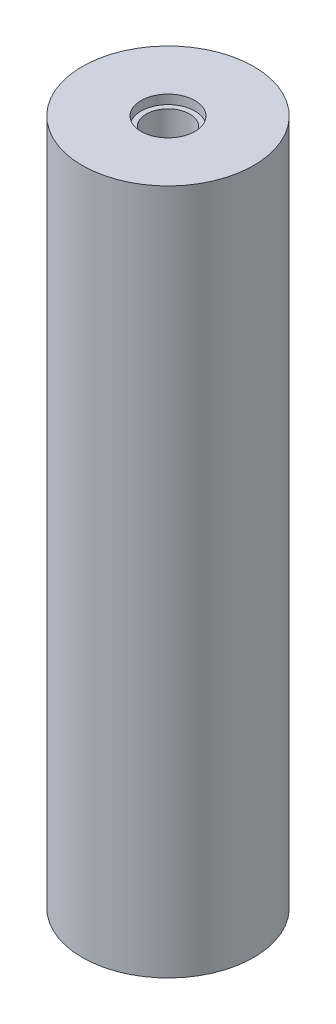
ISO-10303-21;
HEADER;
FILE_DESCRIPTION(('STEP AP214'),'2;1');
FILE_NAME('part.step','',(''),(''),'','','');
FILE_SCHEMA(('AUTOMOTIVE_DESIGN { 1 0 10303 214 1 1 1 1 }'));
ENDSEC;
DATA;
#1=APPLICATION_CONTEXT('core data for automotive mechanical design processes');
#2=APPLICATION_PROTOCOL_DEFINITION('international standard','automotive_design',2000,#1);
#3=PRODUCT_CONTEXT('',#1,'mechanical');
#4=PRODUCT('Part','Part','',(#3));
#5=PRODUCT_RELATED_PRODUCT_CATEGORY('part','',(#4));
#6=PRODUCT_DEFINITION_FORMATION('','',#4);
#7=PRODUCT_DEFINITION_CONTEXT('part definition',#1,'design');
#8=PRODUCT_DEFINITION('design','',#6,#7);
#9=PRODUCT_DEFINITION_SHAPE('','',#8);
#10=(LENGTH_UNIT() NAMED_UNIT(*) SI_UNIT(.MILLI.,.METRE.));
#11=(NAMED_UNIT(*) PLANE_ANGLE_UNIT() SI_UNIT($,.RADIAN.));
#12=(NAMED_UNIT(*) SI_UNIT($,.STERADIAN.) SOLID_ANGLE_UNIT());
#13=UNCERTAINTY_MEASURE_WITH_UNIT(LENGTH_MEASURE(1.E-05),#10,'distance_accuracy_value','');
#14=(GEOMETRIC_REPRESENTATION_CONTEXT(3) GLOBAL_UNCERTAINTY_ASSIGNED_CONTEXT((#13)) GLOBAL_UNIT_ASSIGNED_CONTEXT((#10,
#11,#12)) REPRESENTATION_CONTEXT('',''));
#15=CARTESIAN_POINT('',(0.,0.,0.));
#16=DIRECTION('',(0.,0.,1.));
#17=DIRECTION('',(1.,0.,0.));
#18=AXIS2_PLACEMENT_3D('',#15,#16,#17);
#19=CARTESIAN_POINT('',(0.,60.,0.));
#20=DIRECTION('',(0.,-1.,0.));
#21=DIRECTION('',(0.,0.,-1.));
#22=AXIS2_PLACEMENT_3D('',#19,#20,#21);
#23=CYLINDRICAL_SURFACE('',#22,7.5);
#24=CARTESIAN_POINT('',(0.,60.,0.));
#25=DIRECTION('',(0.,1.,0.));
#26=DIRECTION('',(0.,0.,1.));
#27=AXIS2_PLACEMENT_3D('',#24,#25,#26);
#28=CIRCLE('',#27,7.5);
#29=CARTESIAN_POINT('',(0.,60.,7.5));
#30=VERTEX_POINT('',#29);
#31=EDGE_CURVE('E10',#30,#30,#28,.T.);
#32=ORIENTED_EDGE('',*,*,#31,.F.);
#33=EDGE_LOOP('',(#32));
#34=FACE_BOUND('',#33,.T.);
#35=CARTESIAN_POINT('',(0.,0.,0.));
#36=DIRECTION('',(0.,1.,0.));
#37=DIRECTION('',(0.,0.,1.));
#38=AXIS2_PLACEMENT_3D('',#35,#36,#37);
#39=CIRCLE('',#38,7.5);
#40=CARTESIAN_POINT('',(0.,0.,7.5));
#41=VERTEX_POINT('',#40);
#42=EDGE_CURVE('E44',#41,#41,#39,.T.);
#43=ORIENTED_EDGE('',*,*,#42,.T.);
#44=EDGE_LOOP('',(#43));
#45=FACE_BOUND('',#44,.T.);
#46=ADVANCED_FACE('F37',(#34,#45),#23,.T.);
#47=CARTESIAN_POINT('',(0.,60.,0.));
#48=DIRECTION('',(0.,1.,0.));
#49=DIRECTION('',(0.,0.,1.));
#50=AXIS2_PLACEMENT_3D('',#47,#48,#49);
#51=PLANE('',#50);
#52=CARTESIAN_POINT('',(0.,60.,0.));
#53=DIRECTION('',(0.,1.,0.));
#54=DIRECTION('',(0.,0.,1.));
#55=AXIS2_PLACEMENT_3D('',#52,#53,#54);
#56=CIRCLE('',#55,2.35);
#57=CARTESIAN_POINT('',(0.,60.,2.35));
#58=VERTEX_POINT('',#57);
#59=EDGE_CURVE('E61',#58,#58,#56,.T.);
#60=ORIENTED_EDGE('',*,*,#59,.F.);
#61=EDGE_LOOP('',(#60));
#62=FACE_BOUND('',#61,.T.);
#63=ORIENTED_EDGE('',*,*,#31,.T.);
#64=EDGE_LOOP('',(#63));
#65=FACE_BOUND('',#64,.T.);
#66=ADVANCED_FACE('F95',(#62,#65),#51,.T.);
#67=CARTESIAN_POINT('',(0.,0.,0.));
#68=DIRECTION('',(0.,1.,0.));
#69=DIRECTION('',(0.,0.,1.));
#70=AXIS2_PLACEMENT_3D('',#67,#68,#69);
#71=PLANE('',#70);
#72=CARTESIAN_POINT('',(0.,0.,0.));
#73=DIRECTION('',(0.,-1.,0.));
#74=DIRECTION('',(0.,0.,-1.));
#75=AXIS2_PLACEMENT_3D('',#72,#73,#74);
#76=CIRCLE('',#75,2.35);
#77=CARTESIAN_POINT('',(0.,0.,-2.35));
#78=VERTEX_POINT('',#77);
#79=EDGE_CURVE('E68',#78,#78,#76,.T.);
#80=ORIENTED_EDGE('',*,*,#79,.F.);
#81=EDGE_LOOP('',(#80));
#82=FACE_BOUND('',#81,.T.);
#83=ORIENTED_EDGE('',*,*,#42,.F.);
#84=EDGE_LOOP('',(#83));
#85=FACE_BOUND('',#84,.T.);
#86=ADVANCED_FACE('F101',(#82,#85),#71,.F.);
#87=CARTESIAN_POINT('',(0.,59.2,0.));
#88=DIRECTION('',(0.,1.,0.));
#89=DIRECTION('',(0.,0.,1.));
#90=AXIS2_PLACEMENT_3D('',#87,#88,#89);
#91=PLANE('',#90);
#92=CARTESIAN_POINT('',(0.,59.2,0.));
#93=DIRECTION('',(0.,1.,0.));
#94=DIRECTION('',(0.,0.,1.));
#95=AXIS2_PLACEMENT_3D('',#92,#93,#94);
#96=CIRCLE('',#95,2.35);
#97=CARTESIAN_POINT('',(0.,59.2,2.35));
#98=VERTEX_POINT('',#97);
#99=EDGE_CURVE('E56',#98,#98,#96,.T.);
#100=ORIENTED_EDGE('',*,*,#99,.T.);
#101=EDGE_LOOP('',(#100));
#102=FACE_BOUND('',#101,.T.);
#103=CARTESIAN_POINT('',(0.,59.2,0.));
#104=DIRECTION('',(0.,1.,0.));
#105=DIRECTION('',(0.,0.,1.));
#106=AXIS2_PLACEMENT_3D('',#103,#104,#105);
#107=CIRCLE('',#106,1.9);
#108=CARTESIAN_POINT('',(0.,59.2,1.9));
#109=VERTEX_POINT('',#108);
#110=EDGE_CURVE('E53',#109,#109,#107,.F.);
#111=ORIENTED_EDGE('',*,*,#110,.T.);
#112=EDGE_LOOP('',(#111));
#113=FACE_BOUND('',#112,.T.);
#114=ADVANCED_FACE('F108',(#102,#113),#91,.T.);
#115=CARTESIAN_POINT('',(0.,59.2,0.));
#116=DIRECTION('',(0.,1.,0.));
#117=DIRECTION('',(0.,0.,1.));
#118=AXIS2_PLACEMENT_3D('',#115,#116,#117);
#119=CYLINDRICAL_SURFACE('',#118,2.35);
#120=ORIENTED_EDGE('',*,*,#99,.F.);
#121=EDGE_LOOP('',(#120));
#122=FACE_BOUND('',#121,.T.);
#123=ORIENTED_EDGE('',*,*,#59,.T.);
#124=EDGE_LOOP('',(#123));
#125=FACE_BOUND('',#124,.T.);
#126=ADVANCED_FACE('F115',(#122,#125),#119,.F.);
#127=CARTESIAN_POINT('',(0.,54.8,0.));
#128=DIRECTION('',(0.,1.,0.));
#129=DIRECTION('',(0.,0.,1.));
#130=AXIS2_PLACEMENT_3D('',#127,#128,#129);
#131=PLANE('',#130);
#132=CARTESIAN_POINT('',(0.,54.8,0.));
#133=DIRECTION('',(0.,1.,0.));
#134=DIRECTION('',(0.,0.,1.));
#135=AXIS2_PLACEMENT_3D('',#132,#133,#134);
#136=CIRCLE('',#135,1.9);
#137=CARTESIAN_POINT('',(0.,54.8,1.9));
#138=VERTEX_POINT('',#137);
#139=EDGE_CURVE('E49',#138,#138,#136,.T.);
#140=ORIENTED_EDGE('',*,*,#139,.T.);
#141=EDGE_LOOP('',(#140));
#142=FACE_BOUND('',#141,.T.);
#143=ADVANCED_FACE('F120',(#142),#131,.T.);
#144=CARTESIAN_POINT('',(0.,54.8,0.));
#145=DIRECTION('',(0.,1.,0.));
#146=DIRECTION('',(0.,0.,1.));
#147=AXIS2_PLACEMENT_3D('',#144,#145,#146);
#148=CYLINDRICAL_SURFACE('',#147,1.9);
#149=ORIENTED_EDGE('',*,*,#139,.F.);
#150=EDGE_LOOP('',(#149));
#151=FACE_BOUND('',#150,.T.);
#152=ORIENTED_EDGE('',*,*,#110,.F.);
#153=EDGE_LOOP('',(#152));
#154=FACE_BOUND('',#153,.T.);
#155=ADVANCED_FACE('F119',(#151,#154),#148,.F.);
#156=CARTESIAN_POINT('',(0.,0.8,0.));
#157=DIRECTION('',(0.,-1.,0.));
#158=DIRECTION('',(0.,0.,-1.));
#159=AXIS2_PLACEMENT_3D('',#156,#157,#158);
#160=PLANE('',#159);
#161=CARTESIAN_POINT('',(0.,0.8,0.));
#162=DIRECTION('',(0.,-1.,0.));
#163=DIRECTION('',(0.,0.,-1.));
#164=AXIS2_PLACEMENT_3D('',#161,#162,#163);
#165=CIRCLE('',#164,2.35);
#166=CARTESIAN_POINT('',(0.,0.8,-2.35));
#167=VERTEX_POINT('',#166);
#168=EDGE_CURVE('E71',#167,#167,#165,.T.);
#169=ORIENTED_EDGE('',*,*,#168,.T.);
#170=EDGE_LOOP('',(#169));
#171=FACE_BOUND('',#170,.T.);
#172=CARTESIAN_POINT('',(0.,0.8,0.));
#173=DIRECTION('',(0.,-1.,0.));
#174=DIRECTION('',(0.,0.,-1.));
#175=AXIS2_PLACEMENT_3D('',#172,#173,#174);
#176=CIRCLE('',#175,1.9);
#177=CARTESIAN_POINT('',(0.,0.8,-1.9));
#178=VERTEX_POINT('',#177);
#179=EDGE_CURVE('E40',#178,#178,#176,.F.);
#180=ORIENTED_EDGE('',*,*,#179,.T.);
#181=EDGE_LOOP('',(#180));
#182=FACE_BOUND('',#181,.T.);
#183=ADVANCED_FACE('F78',(#171,#182),#160,.T.);
#184=CARTESIAN_POINT('',(0.,0.8,0.));
#185=DIRECTION('',(0.,-1.,0.));
#186=DIRECTION('',(0.,0.,-1.));
#187=AXIS2_PLACEMENT_3D('',#184,#185,#186);
#188=CYLINDRICAL_SURFACE('',#187,2.35);
#189=ORIENTED_EDGE('',*,*,#168,.F.);
#190=EDGE_LOOP('',(#189));
#191=FACE_BOUND('',#190,.T.);
#192=ORIENTED_EDGE('',*,*,#79,.T.);
#193=EDGE_LOOP('',(#192));
#194=FACE_BOUND('',#193,.T.);
#195=ADVANCED_FACE('F89',(#191,#194),#188,.F.);
#196=CARTESIAN_POINT('',(0.,5.2,0.));
#197=DIRECTION('',(0.,-1.,0.));
#198=DIRECTION('',(0.,0.,-1.));
#199=AXIS2_PLACEMENT_3D('',#196,#197,#198);
#200=PLANE('',#199);
#201=CARTESIAN_POINT('',(0.,5.2,0.));
#202=DIRECTION('',(0.,-1.,0.));
#203=DIRECTION('',(0.,0.,-1.));
#204=AXIS2_PLACEMENT_3D('',#201,#202,#203);
#205=CIRCLE('',#204,1.9);
#206=CARTESIAN_POINT('',(0.,5.2,-1.9));
#207=VERTEX_POINT('',#206);
#208=EDGE_CURVE('E55',#207,#207,#205,.T.);
#209=ORIENTED_EDGE('',*,*,#208,.T.);
#210=EDGE_LOOP('',(#209));
#211=FACE_BOUND('',#210,.T.);
#212=ADVANCED_FACE('F82',(#211),#200,.T.);
#213=CARTESIAN_POINT('',(0.,5.2,0.));
#214=DIRECTION('',(0.,-1.,0.));
#215=DIRECTION('',(0.,0.,-1.));
#216=AXIS2_PLACEMENT_3D('',#213,#214,#215);
#217=CYLINDRICAL_SURFACE('',#216,1.9);
#218=ORIENTED_EDGE('',*,*,#208,.F.);
#219=EDGE_LOOP('',(#218));
#220=FACE_BOUND('',#219,.T.);
#221=ORIENTED_EDGE('',*,*,#179,.F.);
#222=EDGE_LOOP('',(#221));
#223=FACE_BOUND('',#222,.T.);
#224=ADVANCED_FACE('F80',(#220,#223),#217,.F.);
#225=CLOSED_SHELL('',(#46,#66,#86,#114,#126,#143,#155,#183,#195,#212,#224));
#226=MANIFOLD_SOLID_BREP('B2',#225);
#227=ADVANCED_BREP_SHAPE_REPRESENTATION('',(#18,#226),#14);
#228=SHAPE_DEFINITION_REPRESENTATION(#9,#227);
ENDSEC;
END-ISO-10303-21;
